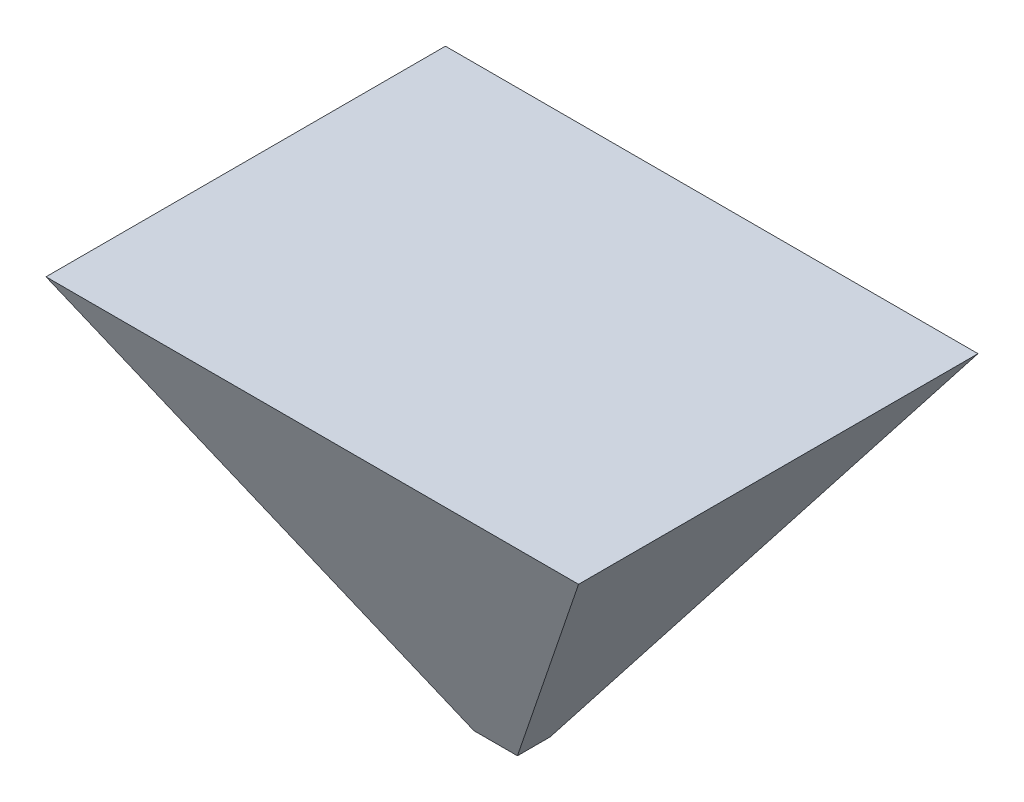
ISO-10303-21;
HEADER;
FILE_DESCRIPTION(('STEP AP214'),'2;1');
FILE_NAME('part.step','',(''),(''),'','','');
FILE_SCHEMA(('AUTOMOTIVE_DESIGN { 1 0 10303 214 1 1 1 1 }'));
ENDSEC;
DATA;
#1=APPLICATION_CONTEXT('core data for automotive mechanical design processes');
#2=APPLICATION_PROTOCOL_DEFINITION('international standard','automotive_design',2000,#1);
#3=PRODUCT_CONTEXT('',#1,'mechanical');
#4=PRODUCT('Part','Part','',(#3));
#5=PRODUCT_RELATED_PRODUCT_CATEGORY('part','',(#4));
#6=PRODUCT_DEFINITION_FORMATION('','',#4);
#7=PRODUCT_DEFINITION_CONTEXT('part definition',#1,'design');
#8=PRODUCT_DEFINITION('design','',#6,#7);
#9=PRODUCT_DEFINITION_SHAPE('','',#8);
#10=(LENGTH_UNIT() NAMED_UNIT(*) SI_UNIT(.MILLI.,.METRE.));
#11=(NAMED_UNIT(*) PLANE_ANGLE_UNIT() SI_UNIT($,.RADIAN.));
#12=(NAMED_UNIT(*) SI_UNIT($,.STERADIAN.) SOLID_ANGLE_UNIT());
#13=UNCERTAINTY_MEASURE_WITH_UNIT(LENGTH_MEASURE(1.E-05),#10,'distance_accuracy_value','');
#14=(GEOMETRIC_REPRESENTATION_CONTEXT(3) GLOBAL_UNCERTAINTY_ASSIGNED_CONTEXT((#13)) GLOBAL_UNIT_ASSIGNED_CONTEXT((#10,
#11,#12)) REPRESENTATION_CONTEXT('',''));
#15=CARTESIAN_POINT('',(0.,0.,0.));
#16=DIRECTION('',(0.,0.,1.));
#17=DIRECTION('',(1.,0.,0.));
#18=AXIS2_PLACEMENT_3D('',#15,#16,#17);
#19=CARTESIAN_POINT('',(0.,30.,0.));
#20=DIRECTION('',(0.,1.,0.));
#21=DIRECTION('',(0.,0.,1.));
#22=AXIS2_PLACEMENT_3D('',#19,#20,#21);
#23=PLANE('',#22);
#24=DIRECTION('',(0.,0.,1.));
#25=VECTOR('',#24,1.);
#26=CARTESIAN_POINT('',(-22.0352555052725,30.,16.5264416289544));
#27=LINE('',#26,#25);
#28=CARTESIAN_POINT('',(-22.0352555052725,30.,-16.5264416289544));
#29=VERTEX_POINT('',#28);
#30=CARTESIAN_POINT('',(-22.0352555052725,30.,16.5264416289544));
#31=VERTEX_POINT('',#30);
#32=EDGE_CURVE('E120',#29,#31,#27,.T.);
#33=ORIENTED_EDGE('',*,*,#32,.T.);
#34=DIRECTION('',(1.,0.,0.));
#35=VECTOR('',#34,1.);
#36=CARTESIAN_POINT('',(22.0352555052725,30.,16.5264416289544));
#37=LINE('',#36,#35);
#38=CARTESIAN_POINT('',(22.0352555052725,30.,16.5264416289544));
#39=VERTEX_POINT('',#38);
#40=EDGE_CURVE('E12',#31,#39,#37,.T.);
#41=ORIENTED_EDGE('',*,*,#40,.T.);
#42=DIRECTION('',(0.,0.,-1.));
#43=VECTOR('',#42,1.);
#44=CARTESIAN_POINT('',(22.0352555052725,30.,16.5264416289544));
#45=LINE('',#44,#43);
#46=CARTESIAN_POINT('',(22.0352555052725,30.,-16.5264416289544));
#47=VERTEX_POINT('',#46);
#48=EDGE_CURVE('E57',#39,#47,#45,.T.);
#49=ORIENTED_EDGE('',*,*,#48,.T.);
#50=DIRECTION('',(-1.,0.,0.));
#51=VECTOR('',#50,1.);
#52=CARTESIAN_POINT('',(22.0352555052725,30.,-16.5264416289544));
#53=LINE('',#52,#51);
#54=EDGE_CURVE('E123',#47,#29,#53,.T.);
#55=ORIENTED_EDGE('',*,*,#54,.T.);
#56=EDGE_LOOP('',(#33,#41,#49,#55));
#57=FACE_BOUND('',#56,.T.);
#58=ADVANCED_FACE('F47',(#57),#23,.T.);
#59=CARTESIAN_POINT('',(0.,0.,0.));
#60=DIRECTION('',(0.,-1.,0.));
#61=DIRECTION('',(0.,0.,-1.));
#62=AXIS2_PLACEMENT_3D('',#59,#60,#61);
#63=PLANE('',#62);
#64=DIRECTION('',(0.,0.,-1.));
#65=VECTOR('',#64,1.);
#66=CARTESIAN_POINT('',(1.8,0.,1.35));
#67=LINE('',#66,#65);
#68=CARTESIAN_POINT('',(1.8,0.,1.35));
#69=VERTEX_POINT('',#68);
#70=CARTESIAN_POINT('',(1.8,0.,-1.35));
#71=VERTEX_POINT('',#70);
#72=EDGE_CURVE('E115',#69,#71,#67,.T.);
#73=ORIENTED_EDGE('',*,*,#72,.F.);
#74=DIRECTION('',(1.,0.,0.));
#75=VECTOR('',#74,1.);
#76=CARTESIAN_POINT('',(-1.8,0.,1.35));
#77=LINE('',#76,#75);
#78=CARTESIAN_POINT('',(-1.8,0.,1.35));
#79=VERTEX_POINT('',#78);
#80=EDGE_CURVE('E99',#79,#69,#77,.T.);
#81=ORIENTED_EDGE('',*,*,#80,.F.);
#82=DIRECTION('',(0.,0.,1.));
#83=VECTOR('',#82,1.);
#84=CARTESIAN_POINT('',(-1.8,0.,1.35));
#85=LINE('',#84,#83);
#86=CARTESIAN_POINT('',(-1.8,0.,-1.35));
#87=VERTEX_POINT('',#86);
#88=EDGE_CURVE('E90',#87,#79,#85,.T.);
#89=ORIENTED_EDGE('',*,*,#88,.F.);
#90=DIRECTION('',(-1.,0.,0.));
#91=VECTOR('',#90,1.);
#92=CARTESIAN_POINT('',(-1.8,0.,-1.35));
#93=LINE('',#92,#91);
#94=EDGE_CURVE('E95',#71,#87,#93,.T.);
#95=ORIENTED_EDGE('',*,*,#94,.F.);
#96=EDGE_LOOP('',(#73,#81,#89,#95));
#97=FACE_BOUND('',#96,.T.);
#98=ADVANCED_FACE('F94',(#97),#63,.T.);
#99=CARTESIAN_POINT('',(0.,-0.543778314054844,1.07491267192185));
#100=DIRECTION('',(0.,-0.451407123524875,0.892318109662131));
#101=DIRECTION('',(0.,-0.892318109662131,-0.451407123524875));
#102=AXIS2_PLACEMENT_3D('',#99,#100,#101);
#103=PLANE('',#102);
#104=DIRECTION('',(0.515677226885563,0.764522928931434,0.386757920164172));
#105=VECTOR('',#104,1.);
#106=CARTESIAN_POINT('',(1.8,0.,1.35));
#107=LINE('',#106,#105);
#108=EDGE_CURVE('E165',#69,#39,#107,.T.);
#109=ORIENTED_EDGE('',*,*,#108,.T.);
#110=ORIENTED_EDGE('',*,*,#40,.F.);
#111=DIRECTION('',(-0.515677226885563,0.764522928931434,0.386757920164172));
#112=VECTOR('',#111,1.);
#113=CARTESIAN_POINT('',(-1.8,0.,1.35));
#114=LINE('',#113,#112);
#115=EDGE_CURVE('E65',#79,#31,#114,.T.);
#116=ORIENTED_EDGE('',*,*,#115,.F.);
#117=ORIENTED_EDGE('',*,*,#80,.T.);
#118=EDGE_LOOP('',(#109,#110,#116,#117));
#119=FACE_BOUND('',#118,.T.);
#120=ADVANCED_FACE('F146',(#119),#103,.T.);
#121=CARTESIAN_POINT('',(-1.23714593407433,-0.834465469110104,0.));
#122=DIRECTION('',(0.829037572555045,0.559192903470742,0.));
#123=DIRECTION('',(-0.559192903470742,0.829037572555045,0.));
#124=AXIS2_PLACEMENT_3D('',#121,#122,#123);
#125=PLANE('',#124);
#126=ORIENTED_EDGE('',*,*,#115,.T.);
#127=ORIENTED_EDGE('',*,*,#32,.F.);
#128=DIRECTION('',(-0.515677226885563,0.764522928931434,-0.386757920164172));
#129=VECTOR('',#128,1.);
#130=CARTESIAN_POINT('',(-1.8,0.,-1.35));
#131=LINE('',#130,#129);
#132=EDGE_CURVE('E112',#87,#29,#131,.T.);
#133=ORIENTED_EDGE('',*,*,#132,.F.);
#134=ORIENTED_EDGE('',*,*,#88,.T.);
#135=EDGE_LOOP('',(#126,#127,#133,#134));
#136=FACE_BOUND('',#135,.T.);
#137=ADVANCED_FACE('F119',(#136),#125,.F.);
#138=CARTESIAN_POINT('',(1.23714593407433,-0.834465469110103,0.));
#139=DIRECTION('',(-0.829037572555045,0.559192903470742,0.));
#140=DIRECTION('',(-0.559192903470742,-0.829037572555045,0.));
#141=AXIS2_PLACEMENT_3D('',#138,#139,#140);
#142=PLANE('',#141);
#143=DIRECTION('',(0.515677226885563,0.764522928931434,-0.386757920164172));
#144=VECTOR('',#143,1.);
#145=CARTESIAN_POINT('',(1.8,0.,-1.35));
#146=LINE('',#145,#144);
#147=EDGE_CURVE('E114',#71,#47,#146,.T.);
#148=ORIENTED_EDGE('',*,*,#147,.T.);
#149=ORIENTED_EDGE('',*,*,#48,.F.);
#150=ORIENTED_EDGE('',*,*,#108,.F.);
#151=ORIENTED_EDGE('',*,*,#72,.T.);
#152=EDGE_LOOP('',(#148,#149,#150,#151));
#153=FACE_BOUND('',#152,.T.);
#154=ADVANCED_FACE('F145',(#153),#142,.F.);
#155=CARTESIAN_POINT('',(0.,-0.543778314054845,-1.07491267192185));
#156=DIRECTION('',(0.,-0.451407123524875,-0.892318109662131));
#157=DIRECTION('',(0.,0.892318109662131,-0.451407123524875));
#158=AXIS2_PLACEMENT_3D('',#155,#156,#157);
#159=PLANE('',#158);
#160=ORIENTED_EDGE('',*,*,#132,.T.);
#161=ORIENTED_EDGE('',*,*,#54,.F.);
#162=ORIENTED_EDGE('',*,*,#147,.F.);
#163=ORIENTED_EDGE('',*,*,#94,.T.);
#164=EDGE_LOOP('',(#160,#161,#162,#163));
#165=FACE_BOUND('',#164,.T.);
#166=ADVANCED_FACE('F110',(#165),#159,.T.);
#167=CLOSED_SHELL('',(#58,#98,#120,#137,#154,#166));
#168=MANIFOLD_SOLID_BREP('B2',#167);
#169=ADVANCED_BREP_SHAPE_REPRESENTATION('',(#18,#168),#14);
#170=SHAPE_DEFINITION_REPRESENTATION(#9,#169);
ENDSEC;
END-ISO-10303-21;
